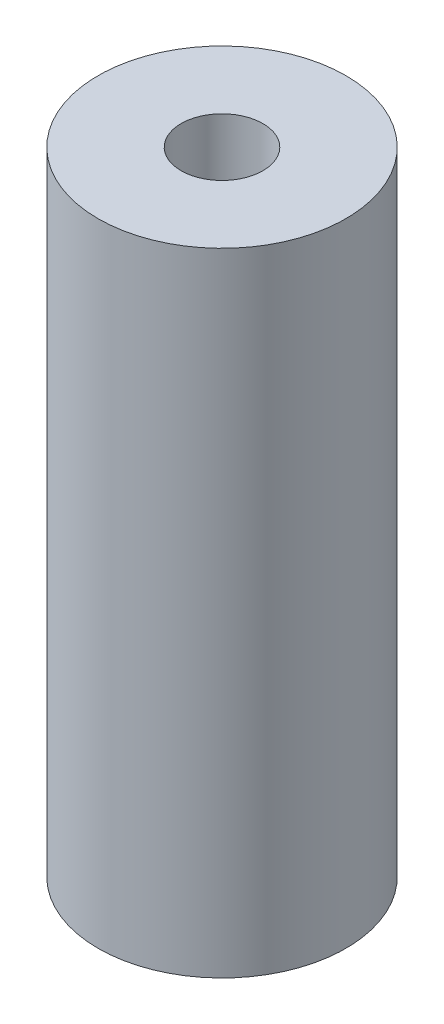
ISO-10303-21;
HEADER;
FILE_DESCRIPTION(('STEP AP214'),'2;1');
FILE_NAME('part.step','',(''),(''),'','','');
FILE_SCHEMA(('AUTOMOTIVE_DESIGN { 1 0 10303 214 1 1 1 1 }'));
ENDSEC;
DATA;
#1=APPLICATION_CONTEXT('core data for automotive mechanical design processes');
#2=APPLICATION_PROTOCOL_DEFINITION('international standard','automotive_design',2000,#1);
#3=PRODUCT_CONTEXT('',#1,'mechanical');
#4=PRODUCT('Part','Part','',(#3));
#5=PRODUCT_RELATED_PRODUCT_CATEGORY('part','',(#4));
#6=PRODUCT_DEFINITION_FORMATION('','',#4);
#7=PRODUCT_DEFINITION_CONTEXT('part definition',#1,'design');
#8=PRODUCT_DEFINITION('design','',#6,#7);
#9=PRODUCT_DEFINITION_SHAPE('','',#8);
#10=(LENGTH_UNIT() NAMED_UNIT(*) SI_UNIT(.MILLI.,.METRE.));
#11=(NAMED_UNIT(*) PLANE_ANGLE_UNIT() SI_UNIT($,.RADIAN.));
#12=(NAMED_UNIT(*) SI_UNIT($,.STERADIAN.) SOLID_ANGLE_UNIT());
#13=UNCERTAINTY_MEASURE_WITH_UNIT(LENGTH_MEASURE(1.E-05),#10,'distance_accuracy_value','');
#14=(GEOMETRIC_REPRESENTATION_CONTEXT(3) GLOBAL_UNCERTAINTY_ASSIGNED_CONTEXT((#13)) GLOBAL_UNIT_ASSIGNED_CONTEXT((#10,
#11,#12)) REPRESENTATION_CONTEXT('',''));
#15=CARTESIAN_POINT('',(0.,0.,0.));
#16=DIRECTION('',(0.,0.,1.));
#17=DIRECTION('',(1.,0.,0.));
#18=AXIS2_PLACEMENT_3D('',#15,#16,#17);
#19=CARTESIAN_POINT('',(0.,25.5,0.));
#20=DIRECTION('',(0.,1.,0.));
#21=DIRECTION('',(0.,0.,1.));
#22=AXIS2_PLACEMENT_3D('',#19,#20,#21);
#23=PLANE('',#22);
#24=CARTESIAN_POINT('',(0.,25.5,0.));
#25=DIRECTION('',(0.,1.,0.));
#26=DIRECTION('',(0.,0.,1.));
#27=AXIS2_PLACEMENT_3D('',#24,#25,#26);
#28=CIRCLE('',#27,5.);
#29=CARTESIAN_POINT('',(0.,25.5,5.));
#30=VERTEX_POINT('',#29);
#31=EDGE_CURVE('E10',#30,#30,#28,.T.);
#32=ORIENTED_EDGE('',*,*,#31,.T.);
#33=EDGE_LOOP('',(#32));
#34=FACE_BOUND('',#33,.T.);
#35=CARTESIAN_POINT('',(0.,25.5,0.));
#36=DIRECTION('',(0.,1.,0.));
#37=DIRECTION('',(0.,0.,1.));
#38=AXIS2_PLACEMENT_3D('',#35,#36,#37);
#39=CIRCLE('',#38,1.65);
#40=CARTESIAN_POINT('',(0.,25.5,1.65));
#41=VERTEX_POINT('',#40);
#42=EDGE_CURVE('E41',#41,#41,#39,.T.);
#43=ORIENTED_EDGE('',*,*,#42,.F.);
#44=EDGE_LOOP('',(#43));
#45=FACE_BOUND('',#44,.T.);
#46=ADVANCED_FACE('F30',(#34,#45),#23,.T.);
#47=CARTESIAN_POINT('',(0.,0.,0.));
#48=DIRECTION('',(0.,1.,0.));
#49=DIRECTION('',(0.,0.,1.));
#50=AXIS2_PLACEMENT_3D('',#47,#48,#49);
#51=PLANE('',#50);
#52=CARTESIAN_POINT('',(0.,0.,0.));
#53=DIRECTION('',(0.,1.,0.));
#54=DIRECTION('',(0.,0.,1.));
#55=AXIS2_PLACEMENT_3D('',#52,#53,#54);
#56=CIRCLE('',#55,5.);
#57=CARTESIAN_POINT('',(0.,0.,5.));
#58=VERTEX_POINT('',#57);
#59=EDGE_CURVE('E34',#58,#58,#56,.T.);
#60=ORIENTED_EDGE('',*,*,#59,.F.);
#61=EDGE_LOOP('',(#60));
#62=FACE_BOUND('',#61,.T.);
#63=CARTESIAN_POINT('',(0.,0.,0.));
#64=DIRECTION('',(0.,1.,0.));
#65=DIRECTION('',(0.,0.,1.));
#66=AXIS2_PLACEMENT_3D('',#63,#64,#65);
#67=CIRCLE('',#66,1.65);
#68=CARTESIAN_POINT('',(0.,0.,1.65));
#69=VERTEX_POINT('',#68);
#70=EDGE_CURVE('E43',#69,#69,#67,.T.);
#71=ORIENTED_EDGE('',*,*,#70,.T.);
#72=EDGE_LOOP('',(#71));
#73=FACE_BOUND('',#72,.T.);
#74=ADVANCED_FACE('F53',(#62,#73),#51,.F.);
#75=CARTESIAN_POINT('',(0.,25.5,0.));
#76=DIRECTION('',(0.,-1.,0.));
#77=DIRECTION('',(0.,0.,-1.));
#78=AXIS2_PLACEMENT_3D('',#75,#76,#77);
#79=CYLINDRICAL_SURFACE('',#78,5.);
#80=ORIENTED_EDGE('',*,*,#31,.F.);
#81=EDGE_LOOP('',(#80));
#82=FACE_BOUND('',#81,.T.);
#83=ORIENTED_EDGE('',*,*,#59,.T.);
#84=EDGE_LOOP('',(#83));
#85=FACE_BOUND('',#84,.T.);
#86=ADVANCED_FACE('F32',(#82,#85),#79,.T.);
#87=CARTESIAN_POINT('',(0.,25.5,0.));
#88=DIRECTION('',(0.,-1.,0.));
#89=DIRECTION('',(0.,0.,-1.));
#90=AXIS2_PLACEMENT_3D('',#87,#88,#89);
#91=CYLINDRICAL_SURFACE('',#90,1.65);
#92=ORIENTED_EDGE('',*,*,#42,.T.);
#93=EDGE_LOOP('',(#92));
#94=FACE_BOUND('',#93,.T.);
#95=ORIENTED_EDGE('',*,*,#70,.F.);
#96=EDGE_LOOP('',(#95));
#97=FACE_BOUND('',#96,.T.);
#98=ADVANCED_FACE('F49',(#94,#97),#91,.F.);
#99=CLOSED_SHELL('',(#46,#74,#86,#98));
#100=MANIFOLD_SOLID_BREP('B2',#99);
#101=ADVANCED_BREP_SHAPE_REPRESENTATION('',(#18,#100),#14);
#102=SHAPE_DEFINITION_REPRESENTATION(#9,#101);
ENDSEC;
END-ISO-10303-21;
